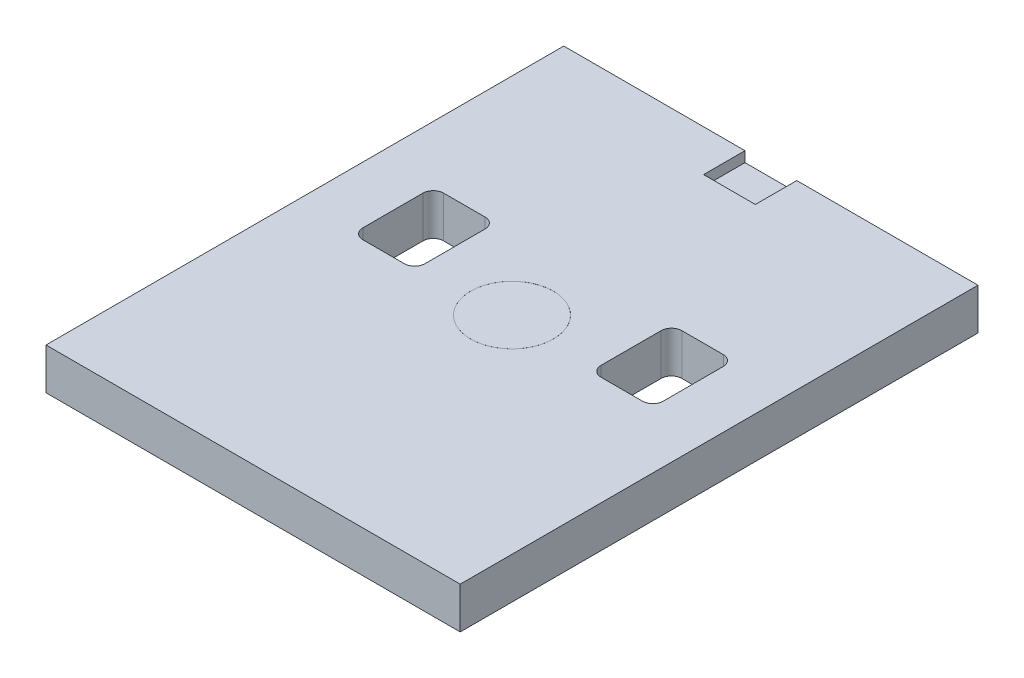
ISO-10303-21;
HEADER;
FILE_DESCRIPTION(('STEP AP214'),'2;1');
FILE_NAME('part.step','',(''),(''),'','','');
FILE_SCHEMA(('AUTOMOTIVE_DESIGN { 1 0 10303 214 1 1 1 1 }'));
ENDSEC;
DATA;
#1=APPLICATION_CONTEXT('core data for automotive mechanical design processes');
#2=APPLICATION_PROTOCOL_DEFINITION('international standard','automotive_design',2000,#1);
#3=PRODUCT_CONTEXT('',#1,'mechanical');
#4=PRODUCT('Part','Part','',(#3));
#5=PRODUCT_RELATED_PRODUCT_CATEGORY('part','',(#4));
#6=PRODUCT_DEFINITION_FORMATION('','',#4);
#7=PRODUCT_DEFINITION_CONTEXT('part definition',#1,'design');
#8=PRODUCT_DEFINITION('design','',#6,#7);
#9=PRODUCT_DEFINITION_SHAPE('','',#8);
#10=(LENGTH_UNIT() NAMED_UNIT(*) SI_UNIT(.MILLI.,.METRE.));
#11=(NAMED_UNIT(*) PLANE_ANGLE_UNIT() SI_UNIT($,.RADIAN.));
#12=(NAMED_UNIT(*) SI_UNIT($,.STERADIAN.) SOLID_ANGLE_UNIT());
#13=UNCERTAINTY_MEASURE_WITH_UNIT(LENGTH_MEASURE(1.E-05),#10,'distance_accuracy_value','');
#14=(GEOMETRIC_REPRESENTATION_CONTEXT(3) GLOBAL_UNCERTAINTY_ASSIGNED_CONTEXT((#13)) GLOBAL_UNIT_ASSIGNED_CONTEXT((#10,
#11,#12)) REPRESENTATION_CONTEXT('',''));
#15=CARTESIAN_POINT('',(0.,0.,0.));
#16=DIRECTION('',(0.,0.,1.));
#17=DIRECTION('',(1.,0.,0.));
#18=AXIS2_PLACEMENT_3D('',#15,#16,#17);
#19=CARTESIAN_POINT('',(-127.,25.4,-158.75));
#20=DIRECTION('',(0.,-1.,0.));
#21=DIRECTION('',(0.,0.,-1.));
#22=AXIS2_PLACEMENT_3D('',#19,#20,#21);
#23=PLANE('',#22);
#24=CARTESIAN_POINT('',(60.3250000000001,25.4,-37.465));
#25=DIRECTION('',(0.,1.,0.));
#26=DIRECTION('',(0.,0.,1.));
#27=AXIS2_PLACEMENT_3D('',#24,#25,#26);
#28=CIRCLE('',#27,6.35);
#29=CARTESIAN_POINT('',(60.3250000000001,25.4,-43.815));
#30=VERTEX_POINT('',#29);
#31=CARTESIAN_POINT('',(53.9750000000001,25.4,-37.465));
#32=VERTEX_POINT('',#31);
#33=EDGE_CURVE('E282',#30,#32,#28,.T.);
#34=ORIENTED_EDGE('',*,*,#33,.F.);
#35=DIRECTION('',(-1.,0.,0.));
#36=VECTOR('',#35,1.);
#37=CARTESIAN_POINT('',(60.3250000000001,25.4,-43.815));
#38=LINE('',#37,#36);
#39=CARTESIAN_POINT('',(85.7250000000001,25.4,-43.815));
#40=VERTEX_POINT('',#39);
#41=EDGE_CURVE('E300',#40,#30,#38,.T.);
#42=ORIENTED_EDGE('',*,*,#41,.F.);
#43=CARTESIAN_POINT('',(85.7250000000001,25.4,-37.465));
#44=DIRECTION('',(0.,1.,0.));
#45=DIRECTION('',(0.,0.,1.));
#46=AXIS2_PLACEMENT_3D('',#43,#44,#45);
#47=CIRCLE('',#46,6.34999999999999);
#48=CARTESIAN_POINT('',(92.0750000000001,25.4,-37.465));
#49=VERTEX_POINT('',#48);
#50=EDGE_CURVE('E297',#49,#40,#47,.T.);
#51=ORIENTED_EDGE('',*,*,#50,.F.);
#52=DIRECTION('',(0.,0.,-1.));
#53=VECTOR('',#52,1.);
#54=CARTESIAN_POINT('',(92.0750000000001,25.4,-37.465));
#55=LINE('',#54,#53);
#56=CARTESIAN_POINT('',(92.0750000000001,25.4,-0.635000000000004));
#57=VERTEX_POINT('',#56);
#58=EDGE_CURVE('E294',#57,#49,#55,.T.);
#59=ORIENTED_EDGE('',*,*,#58,.F.);
#60=CARTESIAN_POINT('',(85.7250000000001,25.4,-0.635000000000004));
#61=DIRECTION('',(0.,1.,0.));
#62=DIRECTION('',(0.,0.,1.));
#63=AXIS2_PLACEMENT_3D('',#60,#61,#62);
#64=CIRCLE('',#63,6.35);
#65=CARTESIAN_POINT('',(85.7250000000001,25.4,5.71499999999999));
#66=VERTEX_POINT('',#65);
#67=EDGE_CURVE('E291',#66,#57,#64,.T.);
#68=ORIENTED_EDGE('',*,*,#67,.F.);
#69=DIRECTION('',(1.,0.,0.));
#70=VECTOR('',#69,1.);
#71=CARTESIAN_POINT('',(60.3250000000001,25.4,5.715));
#72=LINE('',#71,#70);
#73=CARTESIAN_POINT('',(60.3250000000001,25.4,5.715));
#74=VERTEX_POINT('',#73);
#75=EDGE_CURVE('E288',#74,#66,#72,.T.);
#76=ORIENTED_EDGE('',*,*,#75,.F.);
#77=CARTESIAN_POINT('',(60.3250000000001,25.4,-0.635000000000004));
#78=DIRECTION('',(0.,1.,0.));
#79=DIRECTION('',(0.,0.,1.));
#80=AXIS2_PLACEMENT_3D('',#77,#78,#79);
#81=CIRCLE('',#80,6.35);
#82=CARTESIAN_POINT('',(53.9750000000001,25.4,-0.635000000000005));
#83=VERTEX_POINT('',#82);
#84=EDGE_CURVE('E285',#83,#74,#81,.T.);
#85=ORIENTED_EDGE('',*,*,#84,.F.);
#86=DIRECTION('',(0.,0.,1.));
#87=VECTOR('',#86,1.);
#88=CARTESIAN_POINT('',(53.9750000000001,25.4,-37.465));
#89=LINE('',#88,#87);
#90=EDGE_CURVE('E281',#32,#83,#89,.T.);
#91=ORIENTED_EDGE('',*,*,#90,.F.);
#92=EDGE_LOOP('',(#34,#42,#51,#59,#68,#76,#85,#91));
#93=FACE_BOUND('',#92,.T.);
#94=DIRECTION('',(1.,0.,0.));
#95=VECTOR('',#94,1.);
#96=CARTESIAN_POINT('',(-15.875,25.4,-133.35));
#97=LINE('',#96,#95);
#98=CARTESIAN_POINT('',(-15.875,25.4,-133.35));
#99=VERTEX_POINT('',#98);
#100=CARTESIAN_POINT('',(15.875,25.4,-133.35));
#101=VERTEX_POINT('',#100);
#102=EDGE_CURVE('E491',#99,#101,#97,.T.);
#103=ORIENTED_EDGE('',*,*,#102,.F.);
#104=DIRECTION('',(0.,0.,1.));
#105=VECTOR('',#104,1.);
#106=CARTESIAN_POINT('',(-15.875,25.4,-133.35));
#107=LINE('',#106,#105);
#108=CARTESIAN_POINT('',(-15.875,25.4,-158.75));
#109=VERTEX_POINT('',#108);
#110=EDGE_CURVE('E482',#109,#99,#107,.T.);
#111=ORIENTED_EDGE('',*,*,#110,.F.);
#112=DIRECTION('',(-1.,0.,0.));
#113=VECTOR('',#112,1.);
#114=CARTESIAN_POINT('',(-127.,25.4,-158.75));
#115=LINE('',#114,#113);
#116=CARTESIAN_POINT('',(-127.,25.4,-158.75));
#117=VERTEX_POINT('',#116);
#118=EDGE_CURVE('E271',#109,#117,#115,.T.);
#119=ORIENTED_EDGE('',*,*,#118,.T.);
#120=DIRECTION('',(0.,0.,1.));
#121=VECTOR('',#120,1.);
#122=CARTESIAN_POINT('',(-127.,25.4,-158.75));
#123=LINE('',#122,#121);
#124=CARTESIAN_POINT('',(-127.,25.4,158.75));
#125=VERTEX_POINT('',#124);
#126=EDGE_CURVE('E270',#117,#125,#123,.T.);
#127=ORIENTED_EDGE('',*,*,#126,.T.);
#128=DIRECTION('',(1.,0.,0.));
#129=VECTOR('',#128,1.);
#130=CARTESIAN_POINT('',(-127.,25.4,158.75));
#131=LINE('',#130,#129);
#132=CARTESIAN_POINT('',(127.,25.4,158.75));
#133=VERTEX_POINT('',#132);
#134=EDGE_CURVE('E273',#125,#133,#131,.T.);
#135=ORIENTED_EDGE('',*,*,#134,.T.);
#136=DIRECTION('',(0.,0.,-1.));
#137=VECTOR('',#136,1.);
#138=CARTESIAN_POINT('',(127.,25.4,-158.75));
#139=LINE('',#138,#137);
#140=CARTESIAN_POINT('',(127.,25.4,-158.75));
#141=VERTEX_POINT('',#140);
#142=EDGE_CURVE('E268',#133,#141,#139,.T.);
#143=ORIENTED_EDGE('',*,*,#142,.T.);
#144=CARTESIAN_POINT('',(15.875,25.4,-158.75));
#145=VERTEX_POINT('',#144);
#146=EDGE_CURVE('E256',#141,#145,#115,.T.);
#147=ORIENTED_EDGE('',*,*,#146,.T.);
#148=DIRECTION('',(0.,0.,-1.));
#149=VECTOR('',#148,1.);
#150=CARTESIAN_POINT('',(15.875,25.4,-133.35));
#151=LINE('',#150,#149);
#152=EDGE_CURVE('E266',#101,#145,#151,.T.);
#153=ORIENTED_EDGE('',*,*,#152,.F.);
#154=EDGE_LOOP('',(#103,#111,#119,#127,#135,#143,#147,#153));
#155=FACE_BOUND('',#154,.T.);
#156=CARTESIAN_POINT('',(-60.3250000000001,25.4,-0.635000000000004));
#157=DIRECTION('',(0.,1.,0.));
#158=DIRECTION('',(0.,0.,-1.));
#159=AXIS2_PLACEMENT_3D('',#156,#157,#158);
#160=CIRCLE('',#159,6.35);
#161=CARTESIAN_POINT('',(-60.3250000000001,25.4,5.715));
#162=VERTEX_POINT('',#161);
#163=CARTESIAN_POINT('',(-53.9750000000001,25.4,-0.635000000000004));
#164=VERTEX_POINT('',#163);
#165=EDGE_CURVE('E95',#162,#164,#160,.T.);
#166=ORIENTED_EDGE('',*,*,#165,.F.);
#167=DIRECTION('',(1.,0.,0.));
#168=VECTOR('',#167,1.);
#169=CARTESIAN_POINT('',(-60.3250000000001,25.4,5.715));
#170=LINE('',#169,#168);
#171=CARTESIAN_POINT('',(-85.7250000000001,25.4,5.715));
#172=VERTEX_POINT('',#171);
#173=EDGE_CURVE('E62',#172,#162,#170,.T.);
#174=ORIENTED_EDGE('',*,*,#173,.F.);
#175=CARTESIAN_POINT('',(-85.7250000000001,25.4,-0.635000000000004));
#176=DIRECTION('',(0.,1.,0.));
#177=DIRECTION('',(0.,0.,-1.));
#178=AXIS2_PLACEMENT_3D('',#175,#176,#177);
#179=CIRCLE('',#178,6.35);
#180=CARTESIAN_POINT('',(-92.0750000000001,25.4,-0.635000000000004));
#181=VERTEX_POINT('',#180);
#182=EDGE_CURVE('E221',#181,#172,#179,.T.);
#183=ORIENTED_EDGE('',*,*,#182,.F.);
#184=DIRECTION('',(0.,0.,1.));
#185=VECTOR('',#184,1.);
#186=CARTESIAN_POINT('',(-92.0750000000001,25.4,-37.465));
#187=LINE('',#186,#185);
#188=CARTESIAN_POINT('',(-92.0750000000001,25.4,-37.465));
#189=VERTEX_POINT('',#188);
#190=EDGE_CURVE('E225',#189,#181,#187,.T.);
#191=ORIENTED_EDGE('',*,*,#190,.F.);
#192=CARTESIAN_POINT('',(-85.7250000000001,25.4,-37.465));
#193=DIRECTION('',(0.,1.,0.));
#194=DIRECTION('',(0.,0.,-1.));
#195=AXIS2_PLACEMENT_3D('',#192,#193,#194);
#196=CIRCLE('',#195,6.34999999999999);
#197=CARTESIAN_POINT('',(-85.7250000000001,25.4,-43.815));
#198=VERTEX_POINT('',#197);
#199=EDGE_CURVE('E228',#198,#189,#196,.T.);
#200=ORIENTED_EDGE('',*,*,#199,.F.);
#201=DIRECTION('',(-1.,0.,0.));
#202=VECTOR('',#201,1.);
#203=CARTESIAN_POINT('',(-60.3250000000001,25.4,-43.815));
#204=LINE('',#203,#202);
#205=CARTESIAN_POINT('',(-60.3250000000001,25.4,-43.815));
#206=VERTEX_POINT('',#205);
#207=EDGE_CURVE('E231',#206,#198,#204,.T.);
#208=ORIENTED_EDGE('',*,*,#207,.F.);
#209=CARTESIAN_POINT('',(-60.3250000000001,25.4,-37.465));
#210=DIRECTION('',(0.,1.,0.));
#211=DIRECTION('',(0.,0.,-1.));
#212=AXIS2_PLACEMENT_3D('',#209,#210,#211);
#213=CIRCLE('',#212,6.35);
#214=CARTESIAN_POINT('',(-53.9750000000001,25.4,-37.465));
#215=VERTEX_POINT('',#214);
#216=EDGE_CURVE('E198',#215,#206,#213,.T.);
#217=ORIENTED_EDGE('',*,*,#216,.F.);
#218=DIRECTION('',(0.,0.,-1.));
#219=VECTOR('',#218,1.);
#220=CARTESIAN_POINT('',(-53.9750000000001,25.4,-37.465));
#221=LINE('',#220,#219);
#222=EDGE_CURVE('E195',#164,#215,#221,.T.);
#223=ORIENTED_EDGE('',*,*,#222,.F.);
#224=EDGE_LOOP('',(#166,#174,#183,#191,#200,#208,#217,#223));
#225=FACE_BOUND('',#224,.T.);
#226=CARTESIAN_POINT('',(0.,25.4,0.));
#227=DIRECTION('',(0.,1.,0.));
#228=DIRECTION('',(0.,0.,1.));
#229=AXIS2_PLACEMENT_3D('',#226,#227,#228);
#230=CIRCLE('',#229,25.4);
#231=CARTESIAN_POINT('',(0.,25.4,25.4));
#232=VERTEX_POINT('',#231);
#233=EDGE_CURVE('E243',#232,#232,#230,.T.);
#234=ORIENTED_EDGE('',*,*,#233,.F.);
#235=EDGE_LOOP('',(#234));
#236=FACE_BOUND('',#235,.T.);
#237=ADVANCED_FACE('F39',(#93,#155,#225,#236),#23,.F.);
#238=CARTESIAN_POINT('',(-127.,0.,-158.75));
#239=DIRECTION('',(0.,-1.,0.));
#240=DIRECTION('',(0.,0.,-1.));
#241=AXIS2_PLACEMENT_3D('',#238,#239,#240);
#242=PLANE('',#241);
#243=DIRECTION('',(-1.,0.,0.));
#244=VECTOR('',#243,1.);
#245=CARTESIAN_POINT('',(60.3250000000001,0.,-43.815));
#246=LINE('',#245,#244);
#247=CARTESIAN_POINT('',(85.7250000000001,0.,-43.815));
#248=VERTEX_POINT('',#247);
#249=CARTESIAN_POINT('',(60.3250000000001,0.,-43.815));
#250=VERTEX_POINT('',#249);
#251=EDGE_CURVE('E303',#248,#250,#246,.T.);
#252=ORIENTED_EDGE('',*,*,#251,.T.);
#253=CARTESIAN_POINT('',(60.3250000000001,0.,-37.465));
#254=DIRECTION('',(0.,1.,0.));
#255=DIRECTION('',(0.,0.,1.));
#256=AXIS2_PLACEMENT_3D('',#253,#254,#255);
#257=CIRCLE('',#256,6.35);
#258=CARTESIAN_POINT('',(53.9750000000001,0.,-37.465));
#259=VERTEX_POINT('',#258);
#260=EDGE_CURVE('E306',#250,#259,#257,.T.);
#261=ORIENTED_EDGE('',*,*,#260,.T.);
#262=DIRECTION('',(0.,0.,1.));
#263=VECTOR('',#262,1.);
#264=CARTESIAN_POINT('',(53.9750000000001,0.,-37.465));
#265=LINE('',#264,#263);
#266=CARTESIAN_POINT('',(53.9750000000001,0.,-0.635000000000005));
#267=VERTEX_POINT('',#266);
#268=EDGE_CURVE('E322',#259,#267,#265,.T.);
#269=ORIENTED_EDGE('',*,*,#268,.T.);
#270=CARTESIAN_POINT('',(60.3250000000001,0.,-0.635000000000004));
#271=DIRECTION('',(0.,1.,0.));
#272=DIRECTION('',(0.,0.,1.));
#273=AXIS2_PLACEMENT_3D('',#270,#271,#272);
#274=CIRCLE('',#273,6.35);
#275=CARTESIAN_POINT('',(60.3250000000001,0.,5.715));
#276=VERTEX_POINT('',#275);
#277=EDGE_CURVE('E319',#267,#276,#274,.T.);
#278=ORIENTED_EDGE('',*,*,#277,.T.);
#279=DIRECTION('',(1.,0.,0.));
#280=VECTOR('',#279,1.);
#281=CARTESIAN_POINT('',(60.3250000000001,0.,5.715));
#282=LINE('',#281,#280);
#283=CARTESIAN_POINT('',(85.7250000000001,0.,5.71499999999999));
#284=VERTEX_POINT('',#283);
#285=EDGE_CURVE('E316',#276,#284,#282,.T.);
#286=ORIENTED_EDGE('',*,*,#285,.T.);
#287=CARTESIAN_POINT('',(85.7250000000001,0.,-0.635000000000004));
#288=DIRECTION('',(0.,1.,0.));
#289=DIRECTION('',(0.,0.,1.));
#290=AXIS2_PLACEMENT_3D('',#287,#288,#289);
#291=CIRCLE('',#290,6.35);
#292=CARTESIAN_POINT('',(92.0750000000001,0.,-0.635000000000004));
#293=VERTEX_POINT('',#292);
#294=EDGE_CURVE('E313',#284,#293,#291,.T.);
#295=ORIENTED_EDGE('',*,*,#294,.T.);
#296=DIRECTION('',(0.,0.,-1.));
#297=VECTOR('',#296,1.);
#298=CARTESIAN_POINT('',(92.0750000000001,0.,-37.465));
#299=LINE('',#298,#297);
#300=CARTESIAN_POINT('',(92.0750000000001,0.,-37.465));
#301=VERTEX_POINT('',#300);
#302=EDGE_CURVE('E310',#293,#301,#299,.T.);
#303=ORIENTED_EDGE('',*,*,#302,.T.);
#304=CARTESIAN_POINT('',(85.7250000000001,0.,-37.465));
#305=DIRECTION('',(0.,1.,0.));
#306=DIRECTION('',(0.,0.,1.));
#307=AXIS2_PLACEMENT_3D('',#304,#305,#306);
#308=CIRCLE('',#307,6.34999999999999);
#309=EDGE_CURVE('E307',#301,#248,#308,.T.);
#310=ORIENTED_EDGE('',*,*,#309,.T.);
#311=EDGE_LOOP('',(#252,#261,#269,#278,#286,#295,#303,#310));
#312=FACE_BOUND('',#311,.T.);
#313=DIRECTION('',(-1.,0.,0.));
#314=VECTOR('',#313,1.);
#315=CARTESIAN_POINT('',(-127.,0.,-158.75));
#316=LINE('',#315,#314);
#317=CARTESIAN_POINT('',(127.,0.,-158.75));
#318=VERTEX_POINT('',#317);
#319=CARTESIAN_POINT('',(-127.,0.,-158.75));
#320=VERTEX_POINT('',#319);
#321=EDGE_CURVE('E241',#318,#320,#316,.T.);
#322=ORIENTED_EDGE('',*,*,#321,.F.);
#323=DIRECTION('',(0.,0.,-1.));
#324=VECTOR('',#323,1.);
#325=CARTESIAN_POINT('',(127.,0.,-158.75));
#326=LINE('',#325,#324);
#327=CARTESIAN_POINT('',(127.,0.,158.75));
#328=VERTEX_POINT('',#327);
#329=EDGE_CURVE('E503',#328,#318,#326,.T.);
#330=ORIENTED_EDGE('',*,*,#329,.F.);
#331=DIRECTION('',(1.,0.,0.));
#332=VECTOR('',#331,1.);
#333=CARTESIAN_POINT('',(-127.,0.,158.75));
#334=LINE('',#333,#332);
#335=CARTESIAN_POINT('',(-127.,0.,158.75));
#336=VERTEX_POINT('',#335);
#337=EDGE_CURVE('E498',#336,#328,#334,.T.);
#338=ORIENTED_EDGE('',*,*,#337,.F.);
#339=DIRECTION('',(0.,0.,1.));
#340=VECTOR('',#339,1.);
#341=CARTESIAN_POINT('',(-127.,0.,-158.75));
#342=LINE('',#341,#340);
#343=EDGE_CURVE('E499',#320,#336,#342,.T.);
#344=ORIENTED_EDGE('',*,*,#343,.F.);
#345=EDGE_LOOP('',(#322,#330,#338,#344));
#346=FACE_BOUND('',#345,.T.);
#347=DIRECTION('',(1.,0.,0.));
#348=VECTOR('',#347,1.);
#349=CARTESIAN_POINT('',(-60.3250000000001,0.,5.715));
#350=LINE('',#349,#348);
#351=CARTESIAN_POINT('',(-85.7250000000001,0.,5.71499999999999));
#352=VERTEX_POINT('',#351);
#353=CARTESIAN_POINT('',(-60.3250000000001,0.,5.71500000000001));
#354=VERTEX_POINT('',#353);
#355=EDGE_CURVE('E214',#352,#354,#350,.T.);
#356=ORIENTED_EDGE('',*,*,#355,.T.);
#357=CARTESIAN_POINT('',(-60.3250000000001,0.,-0.635000000000004));
#358=DIRECTION('',(0.,1.,0.));
#359=DIRECTION('',(0.,0.,-1.));
#360=AXIS2_PLACEMENT_3D('',#357,#358,#359);
#361=CIRCLE('',#360,6.35);
#362=CARTESIAN_POINT('',(-53.9750000000001,0.,-0.635000000000004));
#363=VERTEX_POINT('',#362);
#364=EDGE_CURVE('E102',#354,#363,#361,.T.);
#365=ORIENTED_EDGE('',*,*,#364,.T.);
#366=DIRECTION('',(0.,0.,-1.));
#367=VECTOR('',#366,1.);
#368=CARTESIAN_POINT('',(-53.9750000000001,0.,-37.465));
#369=LINE('',#368,#367);
#370=CARTESIAN_POINT('',(-53.9750000000001,0.,-37.465));
#371=VERTEX_POINT('',#370);
#372=EDGE_CURVE('E193',#363,#371,#369,.T.);
#373=ORIENTED_EDGE('',*,*,#372,.T.);
#374=CARTESIAN_POINT('',(-60.3250000000001,0.,-37.465));
#375=DIRECTION('',(0.,1.,0.));
#376=DIRECTION('',(0.,0.,-1.));
#377=AXIS2_PLACEMENT_3D('',#374,#375,#376);
#378=CIRCLE('',#377,6.35);
#379=CARTESIAN_POINT('',(-60.3250000000001,0.,-43.815));
#380=VERTEX_POINT('',#379);
#381=EDGE_CURVE('E201',#371,#380,#378,.T.);
#382=ORIENTED_EDGE('',*,*,#381,.T.);
#383=DIRECTION('',(-1.,0.,0.));
#384=VECTOR('',#383,1.);
#385=CARTESIAN_POINT('',(-60.3250000000001,0.,-43.815));
#386=LINE('',#385,#384);
#387=CARTESIAN_POINT('',(-85.7250000000001,0.,-43.815));
#388=VERTEX_POINT('',#387);
#389=EDGE_CURVE('E208',#380,#388,#386,.T.);
#390=ORIENTED_EDGE('',*,*,#389,.T.);
#391=CARTESIAN_POINT('',(-85.7250000000001,0.,-37.465));
#392=DIRECTION('',(0.,1.,0.));
#393=DIRECTION('',(0.,0.,-1.));
#394=AXIS2_PLACEMENT_3D('',#391,#392,#393);
#395=CIRCLE('',#394,6.34999999999999);
#396=CARTESIAN_POINT('',(-92.0750000000001,0.,-37.465));
#397=VERTEX_POINT('',#396);
#398=EDGE_CURVE('E350',#388,#397,#395,.T.);
#399=ORIENTED_EDGE('',*,*,#398,.T.);
#400=DIRECTION('',(0.,0.,1.));
#401=VECTOR('',#400,1.);
#402=CARTESIAN_POINT('',(-92.0750000000001,0.,-37.465));
#403=LINE('',#402,#401);
#404=CARTESIAN_POINT('',(-92.0750000000001,0.,-0.635000000000004));
#405=VERTEX_POINT('',#404);
#406=EDGE_CURVE('E347',#397,#405,#403,.T.);
#407=ORIENTED_EDGE('',*,*,#406,.T.);
#408=CARTESIAN_POINT('',(-85.7250000000001,0.,-0.635000000000004));
#409=DIRECTION('',(0.,1.,0.));
#410=DIRECTION('',(0.,0.,-1.));
#411=AXIS2_PLACEMENT_3D('',#408,#409,#410);
#412=CIRCLE('',#411,6.35);
#413=EDGE_CURVE('E242',#405,#352,#412,.T.);
#414=ORIENTED_EDGE('',*,*,#413,.T.);
#415=EDGE_LOOP('',(#356,#365,#373,#382,#390,#399,#407,#414));
#416=FACE_BOUND('',#415,.T.);
#417=CARTESIAN_POINT('',(0.,0.,0.));
#418=DIRECTION('',(0.,1.,0.));
#419=DIRECTION('',(0.,0.,1.));
#420=AXIS2_PLACEMENT_3D('',#417,#418,#419);
#421=CIRCLE('',#420,25.4);
#422=CARTESIAN_POINT('',(0.,0.,25.4));
#423=VERTEX_POINT('',#422);
#424=EDGE_CURVE('E238',#423,#423,#421,.T.);
#425=ORIENTED_EDGE('',*,*,#424,.T.);
#426=EDGE_LOOP('',(#425));
#427=FACE_BOUND('',#426,.T.);
#428=ADVANCED_FACE('F211',(#312,#346,#416,#427),#242,.T.);
#429=CARTESIAN_POINT('',(-127.,25.4,-158.75));
#430=DIRECTION('',(0.,0.,1.));
#431=DIRECTION('',(1.,0.,0.));
#432=AXIS2_PLACEMENT_3D('',#429,#430,#431);
#433=PLANE('',#432);
#434=ORIENTED_EDGE('',*,*,#118,.F.);
#435=DIRECTION('',(0.,-1.,0.));
#436=VECTOR('',#435,1.);
#437=CARTESIAN_POINT('',(-15.875,25.4,-158.75));
#438=LINE('',#437,#436);
#439=CARTESIAN_POINT('',(-15.875,19.05,-158.75));
#440=VERTEX_POINT('',#439);
#441=EDGE_CURVE('E12',#109,#440,#438,.T.);
#442=ORIENTED_EDGE('',*,*,#441,.T.);
#443=DIRECTION('',(1.,0.,0.));
#444=VECTOR('',#443,1.);
#445=CARTESIAN_POINT('',(-127.,19.05,-158.75));
#446=LINE('',#445,#444);
#447=CARTESIAN_POINT('',(15.875,19.05,-158.75));
#448=VERTEX_POINT('',#447);
#449=EDGE_CURVE('E246',#440,#448,#446,.T.);
#450=ORIENTED_EDGE('',*,*,#449,.T.);
#451=DIRECTION('',(0.,1.,0.));
#452=VECTOR('',#451,1.);
#453=CARTESIAN_POINT('',(15.875,25.4,-158.75));
#454=LINE('',#453,#452);
#455=EDGE_CURVE('E46',#448,#145,#454,.T.);
#456=ORIENTED_EDGE('',*,*,#455,.T.);
#457=ORIENTED_EDGE('',*,*,#146,.F.);
#458=DIRECTION('',(0.,-1.,0.));
#459=VECTOR('',#458,1.);
#460=CARTESIAN_POINT('',(127.,25.4,-158.75));
#461=LINE('',#460,#459);
#462=EDGE_CURVE('E506',#141,#318,#461,.T.);
#463=ORIENTED_EDGE('',*,*,#462,.T.);
#464=ORIENTED_EDGE('',*,*,#321,.T.);
#465=DIRECTION('',(0.,-1.,0.));
#466=VECTOR('',#465,1.);
#467=CARTESIAN_POINT('',(-127.,25.4,-158.75));
#468=LINE('',#467,#466);
#469=EDGE_CURVE('E495',#117,#320,#468,.T.);
#470=ORIENTED_EDGE('',*,*,#469,.F.);
#471=EDGE_LOOP('',(#434,#442,#450,#456,#457,#463,#464,#470));
#472=FACE_BOUND('',#471,.T.);
#473=ADVANCED_FACE('F254',(#472),#433,.F.);
#474=CARTESIAN_POINT('',(-127.,25.4,-158.75));
#475=DIRECTION('',(1.,0.,0.));
#476=DIRECTION('',(0.,0.,-1.));
#477=AXIS2_PLACEMENT_3D('',#474,#475,#476);
#478=PLANE('',#477);
#479=ORIENTED_EDGE('',*,*,#343,.T.);
#480=DIRECTION('',(0.,-1.,0.));
#481=VECTOR('',#480,1.);
#482=CARTESIAN_POINT('',(-127.,25.4,158.75));
#483=LINE('',#482,#481);
#484=EDGE_CURVE('E500',#125,#336,#483,.T.);
#485=ORIENTED_EDGE('',*,*,#484,.F.);
#486=ORIENTED_EDGE('',*,*,#126,.F.);
#487=ORIENTED_EDGE('',*,*,#469,.T.);
#488=EDGE_LOOP('',(#479,#485,#486,#487));
#489=FACE_BOUND('',#488,.T.);
#490=ADVANCED_FACE('F389',(#489),#478,.F.);
#491=CARTESIAN_POINT('',(-127.,25.4,158.75));
#492=DIRECTION('',(0.,0.,-1.));
#493=DIRECTION('',(-1.,0.,0.));
#494=AXIS2_PLACEMENT_3D('',#491,#492,#493);
#495=PLANE('',#494);
#496=ORIENTED_EDGE('',*,*,#337,.T.);
#497=DIRECTION('',(0.,-1.,0.));
#498=VECTOR('',#497,1.);
#499=CARTESIAN_POINT('',(127.,25.4,158.75));
#500=LINE('',#499,#498);
#501=EDGE_CURVE('E336',#133,#328,#500,.T.);
#502=ORIENTED_EDGE('',*,*,#501,.F.);
#503=ORIENTED_EDGE('',*,*,#134,.F.);
#504=ORIENTED_EDGE('',*,*,#484,.T.);
#505=EDGE_LOOP('',(#496,#502,#503,#504));
#506=FACE_BOUND('',#505,.T.);
#507=ADVANCED_FACE('F444',(#506),#495,.F.);
#508=CARTESIAN_POINT('',(127.,25.4,-158.75));
#509=DIRECTION('',(-1.,0.,0.));
#510=DIRECTION('',(0.,0.,1.));
#511=AXIS2_PLACEMENT_3D('',#508,#509,#510);
#512=PLANE('',#511);
#513=ORIENTED_EDGE('',*,*,#329,.T.);
#514=ORIENTED_EDGE('',*,*,#462,.F.);
#515=ORIENTED_EDGE('',*,*,#142,.F.);
#516=ORIENTED_EDGE('',*,*,#501,.T.);
#517=EDGE_LOOP('',(#513,#514,#515,#516));
#518=FACE_BOUND('',#517,.T.);
#519=ADVANCED_FACE('F440',(#518),#512,.F.);
#520=CARTESIAN_POINT('',(60.3250000000001,25.4,-37.465));
#521=DIRECTION('',(0.,-1.,0.));
#522=DIRECTION('',(0.,0.,-1.));
#523=AXIS2_PLACEMENT_3D('',#520,#521,#522);
#524=CYLINDRICAL_SURFACE('',#523,6.35);
#525=ORIENTED_EDGE('',*,*,#260,.F.);
#526=DIRECTION('',(0.,-1.,0.));
#527=VECTOR('',#526,1.);
#528=CARTESIAN_POINT('',(60.3250000000001,25.4,-43.815));
#529=LINE('',#528,#527);
#530=EDGE_CURVE('E237',#30,#250,#529,.T.);
#531=ORIENTED_EDGE('',*,*,#530,.F.);
#532=ORIENTED_EDGE('',*,*,#33,.T.);
#533=DIRECTION('',(0.,-1.,0.));
#534=VECTOR('',#533,1.);
#535=CARTESIAN_POINT('',(53.9750000000001,25.4,-37.465));
#536=LINE('',#535,#534);
#537=EDGE_CURVE('E278',#32,#259,#536,.T.);
#538=ORIENTED_EDGE('',*,*,#537,.T.);
#539=EDGE_LOOP('',(#525,#531,#532,#538));
#540=FACE_BOUND('',#539,.T.);
#541=ADVANCED_FACE('F436',(#540),#524,.F.);
#542=CARTESIAN_POINT('',(53.9750000000001,25.4,-37.465));
#543=DIRECTION('',(1.,0.,0.));
#544=DIRECTION('',(0.,0.,-1.));
#545=AXIS2_PLACEMENT_3D('',#542,#543,#544);
#546=PLANE('',#545);
#547=ORIENTED_EDGE('',*,*,#268,.F.);
#548=ORIENTED_EDGE('',*,*,#537,.F.);
#549=ORIENTED_EDGE('',*,*,#90,.T.);
#550=DIRECTION('',(0.,-1.,0.));
#551=VECTOR('',#550,1.);
#552=CARTESIAN_POINT('',(53.9750000000001,25.4,-0.635000000000005));
#553=LINE('',#552,#551);
#554=EDGE_CURVE('E283',#83,#267,#553,.T.);
#555=ORIENTED_EDGE('',*,*,#554,.T.);
#556=EDGE_LOOP('',(#547,#548,#549,#555));
#557=FACE_BOUND('',#556,.T.);
#558=ADVANCED_FACE('F432',(#557),#546,.T.);
#559=CARTESIAN_POINT('',(60.3250000000001,25.4,-0.635000000000004));
#560=DIRECTION('',(0.,-1.,0.));
#561=DIRECTION('',(0.,0.,-1.));
#562=AXIS2_PLACEMENT_3D('',#559,#560,#561);
#563=CYLINDRICAL_SURFACE('',#562,6.35);
#564=ORIENTED_EDGE('',*,*,#277,.F.);
#565=ORIENTED_EDGE('',*,*,#554,.F.);
#566=ORIENTED_EDGE('',*,*,#84,.T.);
#567=DIRECTION('',(0.,-1.,0.));
#568=VECTOR('',#567,1.);
#569=CARTESIAN_POINT('',(60.3250000000001,25.4,5.715));
#570=LINE('',#569,#568);
#571=EDGE_CURVE('E286',#74,#276,#570,.T.);
#572=ORIENTED_EDGE('',*,*,#571,.T.);
#573=EDGE_LOOP('',(#564,#565,#566,#572));
#574=FACE_BOUND('',#573,.T.);
#575=ADVANCED_FACE('F428',(#574),#563,.F.);
#576=CARTESIAN_POINT('',(60.3250000000001,25.4,5.715));
#577=DIRECTION('',(0.,0.,-1.));
#578=DIRECTION('',(-1.,0.,0.));
#579=AXIS2_PLACEMENT_3D('',#576,#577,#578);
#580=PLANE('',#579);
#581=ORIENTED_EDGE('',*,*,#285,.F.);
#582=ORIENTED_EDGE('',*,*,#571,.F.);
#583=ORIENTED_EDGE('',*,*,#75,.T.);
#584=DIRECTION('',(0.,-1.,0.));
#585=VECTOR('',#584,1.);
#586=CARTESIAN_POINT('',(85.7250000000001,25.4,5.71499999999999));
#587=LINE('',#586,#585);
#588=EDGE_CURVE('E289',#66,#284,#587,.T.);
#589=ORIENTED_EDGE('',*,*,#588,.T.);
#590=EDGE_LOOP('',(#581,#582,#583,#589));
#591=FACE_BOUND('',#590,.T.);
#592=ADVANCED_FACE('F424',(#591),#580,.T.);
#593=CARTESIAN_POINT('',(85.7250000000001,25.4,-0.635000000000004));
#594=DIRECTION('',(0.,-1.,0.));
#595=DIRECTION('',(0.,0.,-1.));
#596=AXIS2_PLACEMENT_3D('',#593,#594,#595);
#597=CYLINDRICAL_SURFACE('',#596,6.35);
#598=ORIENTED_EDGE('',*,*,#294,.F.);
#599=ORIENTED_EDGE('',*,*,#588,.F.);
#600=ORIENTED_EDGE('',*,*,#67,.T.);
#601=DIRECTION('',(0.,-1.,0.));
#602=VECTOR('',#601,1.);
#603=CARTESIAN_POINT('',(92.0750000000001,25.4,-0.635000000000004));
#604=LINE('',#603,#602);
#605=EDGE_CURVE('E292',#57,#293,#604,.T.);
#606=ORIENTED_EDGE('',*,*,#605,.T.);
#607=EDGE_LOOP('',(#598,#599,#600,#606));
#608=FACE_BOUND('',#607,.T.);
#609=ADVANCED_FACE('F420',(#608),#597,.F.);
#610=CARTESIAN_POINT('',(92.0750000000001,25.4,-37.465));
#611=DIRECTION('',(-1.,0.,0.));
#612=DIRECTION('',(0.,0.,1.));
#613=AXIS2_PLACEMENT_3D('',#610,#611,#612);
#614=PLANE('',#613);
#615=ORIENTED_EDGE('',*,*,#302,.F.);
#616=ORIENTED_EDGE('',*,*,#605,.F.);
#617=ORIENTED_EDGE('',*,*,#58,.T.);
#618=DIRECTION('',(0.,-1.,0.));
#619=VECTOR('',#618,1.);
#620=CARTESIAN_POINT('',(92.0750000000001,25.4,-37.465));
#621=LINE('',#620,#619);
#622=EDGE_CURVE('E295',#49,#301,#621,.T.);
#623=ORIENTED_EDGE('',*,*,#622,.T.);
#624=EDGE_LOOP('',(#615,#616,#617,#623));
#625=FACE_BOUND('',#624,.T.);
#626=ADVANCED_FACE('F416',(#625),#614,.T.);
#627=CARTESIAN_POINT('',(85.7250000000001,25.4,-37.465));
#628=DIRECTION('',(0.,-1.,0.));
#629=DIRECTION('',(0.,0.,-1.));
#630=AXIS2_PLACEMENT_3D('',#627,#628,#629);
#631=CYLINDRICAL_SURFACE('',#630,6.34999999999999);
#632=ORIENTED_EDGE('',*,*,#309,.F.);
#633=ORIENTED_EDGE('',*,*,#622,.F.);
#634=ORIENTED_EDGE('',*,*,#50,.T.);
#635=DIRECTION('',(0.,-1.,0.));
#636=VECTOR('',#635,1.);
#637=CARTESIAN_POINT('',(85.7250000000001,25.4,-43.815));
#638=LINE('',#637,#636);
#639=EDGE_CURVE('E298',#40,#248,#638,.T.);
#640=ORIENTED_EDGE('',*,*,#639,.T.);
#641=EDGE_LOOP('',(#632,#633,#634,#640));
#642=FACE_BOUND('',#641,.T.);
#643=ADVANCED_FACE('F412',(#642),#631,.F.);
#644=CARTESIAN_POINT('',(60.3250000000001,25.4,-43.815));
#645=DIRECTION('',(0.,0.,1.));
#646=DIRECTION('',(1.,0.,0.));
#647=AXIS2_PLACEMENT_3D('',#644,#645,#646);
#648=PLANE('',#647);
#649=ORIENTED_EDGE('',*,*,#251,.F.);
#650=ORIENTED_EDGE('',*,*,#639,.F.);
#651=ORIENTED_EDGE('',*,*,#41,.T.);
#652=ORIENTED_EDGE('',*,*,#530,.T.);
#653=EDGE_LOOP('',(#649,#650,#651,#652));
#654=FACE_BOUND('',#653,.T.);
#655=ADVANCED_FACE('F409',(#654),#648,.T.);
#656=CARTESIAN_POINT('',(-60.3250000000001,25.4,-0.635000000000004));
#657=DIRECTION('',(0.,-1.,0.));
#658=DIRECTION('',(0.,0.,-1.));
#659=AXIS2_PLACEMENT_3D('',#656,#657,#658);
#660=CYLINDRICAL_SURFACE('',#659,6.35);
#661=ORIENTED_EDGE('',*,*,#364,.F.);
#662=DIRECTION('',(0.,-1.,0.));
#663=VECTOR('',#662,1.);
#664=CARTESIAN_POINT('',(-60.3250000000001,25.4,5.715));
#665=LINE('',#664,#663);
#666=EDGE_CURVE('E219',#162,#354,#665,.T.);
#667=ORIENTED_EDGE('',*,*,#666,.F.);
#668=ORIENTED_EDGE('',*,*,#165,.T.);
#669=DIRECTION('',(0.,-1.,0.));
#670=VECTOR('',#669,1.);
#671=CARTESIAN_POINT('',(-53.9750000000001,25.4,-0.635000000000004));
#672=LINE('',#671,#670);
#673=EDGE_CURVE('E235',#164,#363,#672,.T.);
#674=ORIENTED_EDGE('',*,*,#673,.T.);
#675=EDGE_LOOP('',(#661,#667,#668,#674));
#676=FACE_BOUND('',#675,.T.);
#677=ADVANCED_FACE('F372',(#676),#660,.F.);
#678=CARTESIAN_POINT('',(-53.9750000000001,25.4,-37.465));
#679=DIRECTION('',(-1.,0.,0.));
#680=DIRECTION('',(0.,0.,1.));
#681=AXIS2_PLACEMENT_3D('',#678,#679,#680);
#682=PLANE('',#681);
#683=ORIENTED_EDGE('',*,*,#372,.F.);
#684=ORIENTED_EDGE('',*,*,#673,.F.);
#685=ORIENTED_EDGE('',*,*,#222,.T.);
#686=DIRECTION('',(0.,-1.,0.));
#687=VECTOR('',#686,1.);
#688=CARTESIAN_POINT('',(-53.9750000000001,25.4,-37.465));
#689=LINE('',#688,#687);
#690=EDGE_CURVE('E189',#215,#371,#689,.T.);
#691=ORIENTED_EDGE('',*,*,#690,.T.);
#692=EDGE_LOOP('',(#683,#684,#685,#691));
#693=FACE_BOUND('',#692,.T.);
#694=ADVANCED_FACE('F191',(#693),#682,.T.);
#695=CARTESIAN_POINT('',(-60.3250000000001,25.4,-37.465));
#696=DIRECTION('',(0.,-1.,0.));
#697=DIRECTION('',(0.,0.,-1.));
#698=AXIS2_PLACEMENT_3D('',#695,#696,#697);
#699=CYLINDRICAL_SURFACE('',#698,6.35);
#700=ORIENTED_EDGE('',*,*,#381,.F.);
#701=ORIENTED_EDGE('',*,*,#690,.F.);
#702=ORIENTED_EDGE('',*,*,#216,.T.);
#703=DIRECTION('',(0.,-1.,0.));
#704=VECTOR('',#703,1.);
#705=CARTESIAN_POINT('',(-60.3250000000001,25.4,-43.815));
#706=LINE('',#705,#704);
#707=EDGE_CURVE('E204',#206,#380,#706,.T.);
#708=ORIENTED_EDGE('',*,*,#707,.T.);
#709=EDGE_LOOP('',(#700,#701,#702,#708));
#710=FACE_BOUND('',#709,.T.);
#711=ADVANCED_FACE('F202',(#710),#699,.F.);
#712=CARTESIAN_POINT('',(-60.3250000000001,25.4,-43.815));
#713=DIRECTION('',(0.,0.,1.));
#714=DIRECTION('',(1.,0.,0.));
#715=AXIS2_PLACEMENT_3D('',#712,#713,#714);
#716=PLANE('',#715);
#717=ORIENTED_EDGE('',*,*,#389,.F.);
#718=ORIENTED_EDGE('',*,*,#707,.F.);
#719=ORIENTED_EDGE('',*,*,#207,.T.);
#720=DIRECTION('',(0.,-1.,0.));
#721=VECTOR('',#720,1.);
#722=CARTESIAN_POINT('',(-85.7250000000001,25.4,-43.815));
#723=LINE('',#722,#721);
#724=EDGE_CURVE('E230',#198,#388,#723,.T.);
#725=ORIENTED_EDGE('',*,*,#724,.T.);
#726=EDGE_LOOP('',(#717,#718,#719,#725));
#727=FACE_BOUND('',#726,.T.);
#728=ADVANCED_FACE('F354',(#727),#716,.T.);
#729=CARTESIAN_POINT('',(-85.7250000000001,25.4,-37.465));
#730=DIRECTION('',(0.,-1.,0.));
#731=DIRECTION('',(0.,0.,-1.));
#732=AXIS2_PLACEMENT_3D('',#729,#730,#731);
#733=CYLINDRICAL_SURFACE('',#732,6.34999999999999);
#734=ORIENTED_EDGE('',*,*,#398,.F.);
#735=ORIENTED_EDGE('',*,*,#724,.F.);
#736=ORIENTED_EDGE('',*,*,#199,.T.);
#737=DIRECTION('',(0.,-1.,0.));
#738=VECTOR('',#737,1.);
#739=CARTESIAN_POINT('',(-92.0750000000001,25.4,-37.465));
#740=LINE('',#739,#738);
#741=EDGE_CURVE('E227',#189,#397,#740,.T.);
#742=ORIENTED_EDGE('',*,*,#741,.T.);
#743=EDGE_LOOP('',(#734,#735,#736,#742));
#744=FACE_BOUND('',#743,.T.);
#745=ADVANCED_FACE('F359',(#744),#733,.F.);
#746=CARTESIAN_POINT('',(-92.0750000000001,25.4,-37.465));
#747=DIRECTION('',(1.,0.,0.));
#748=DIRECTION('',(0.,0.,-1.));
#749=AXIS2_PLACEMENT_3D('',#746,#747,#748);
#750=PLANE('',#749);
#751=ORIENTED_EDGE('',*,*,#406,.F.);
#752=ORIENTED_EDGE('',*,*,#741,.F.);
#753=ORIENTED_EDGE('',*,*,#190,.T.);
#754=DIRECTION('',(0.,-1.,0.));
#755=VECTOR('',#754,1.);
#756=CARTESIAN_POINT('',(-92.0750000000001,25.4,-0.635000000000004));
#757=LINE('',#756,#755);
#758=EDGE_CURVE('E224',#181,#405,#757,.T.);
#759=ORIENTED_EDGE('',*,*,#758,.T.);
#760=EDGE_LOOP('',(#751,#752,#753,#759));
#761=FACE_BOUND('',#760,.T.);
#762=ADVANCED_FACE('F364',(#761),#750,.T.);
#763=CARTESIAN_POINT('',(-85.7250000000001,25.4,-0.635000000000004));
#764=DIRECTION('',(0.,-1.,0.));
#765=DIRECTION('',(0.,0.,-1.));
#766=AXIS2_PLACEMENT_3D('',#763,#764,#765);
#767=CYLINDRICAL_SURFACE('',#766,6.35);
#768=ORIENTED_EDGE('',*,*,#413,.F.);
#769=ORIENTED_EDGE('',*,*,#758,.F.);
#770=ORIENTED_EDGE('',*,*,#182,.T.);
#771=DIRECTION('',(0.,-1.,0.));
#772=VECTOR('',#771,1.);
#773=CARTESIAN_POINT('',(-85.7250000000001,25.4,5.71499999999999));
#774=LINE('',#773,#772);
#775=EDGE_CURVE('E220',#172,#352,#774,.T.);
#776=ORIENTED_EDGE('',*,*,#775,.T.);
#777=EDGE_LOOP('',(#768,#769,#770,#776));
#778=FACE_BOUND('',#777,.T.);
#779=ADVANCED_FACE('F369',(#778),#767,.F.);
#780=CARTESIAN_POINT('',(-60.3250000000001,25.4,5.715));
#781=DIRECTION('',(0.,0.,-1.));
#782=DIRECTION('',(-1.,0.,0.));
#783=AXIS2_PLACEMENT_3D('',#780,#781,#782);
#784=PLANE('',#783);
#785=ORIENTED_EDGE('',*,*,#355,.F.);
#786=ORIENTED_EDGE('',*,*,#775,.F.);
#787=ORIENTED_EDGE('',*,*,#173,.T.);
#788=ORIENTED_EDGE('',*,*,#666,.T.);
#789=EDGE_LOOP('',(#785,#786,#787,#788));
#790=FACE_BOUND('',#789,.T.);
#791=ADVANCED_FACE('F371',(#790),#784,.T.);
#792=CARTESIAN_POINT('',(0.,25.4,0.));
#793=DIRECTION('',(0.,-1.,0.));
#794=DIRECTION('',(0.,0.,-1.));
#795=AXIS2_PLACEMENT_3D('',#792,#793,#794);
#796=CYLINDRICAL_SURFACE('',#795,25.4);
#797=ORIENTED_EDGE('',*,*,#233,.T.);
#798=EDGE_LOOP('',(#797));
#799=FACE_BOUND('',#798,.T.);
#800=ORIENTED_EDGE('',*,*,#424,.F.);
#801=EDGE_LOOP('',(#800));
#802=FACE_BOUND('',#801,.T.);
#803=ADVANCED_FACE('F378',(#799,#802),#796,.F.);
#804=CARTESIAN_POINT('',(-15.875,19.05,-133.35));
#805=DIRECTION('',(-1.,0.,0.));
#806=DIRECTION('',(0.,0.,1.));
#807=AXIS2_PLACEMENT_3D('',#804,#805,#806);
#808=PLANE('',#807);
#809=ORIENTED_EDGE('',*,*,#110,.T.);
#810=DIRECTION('',(0.,1.,0.));
#811=VECTOR('',#810,1.);
#812=CARTESIAN_POINT('',(-15.875,19.05,-133.35));
#813=LINE('',#812,#811);
#814=CARTESIAN_POINT('',(-15.875,19.05,-133.35));
#815=VERTEX_POINT('',#814);
#816=EDGE_CURVE('E479',#815,#99,#813,.T.);
#817=ORIENTED_EDGE('',*,*,#816,.F.);
#818=DIRECTION('',(0.,0.,1.));
#819=VECTOR('',#818,1.);
#820=CARTESIAN_POINT('',(-15.875,19.05,-133.35));
#821=LINE('',#820,#819);
#822=EDGE_CURVE('E469',#440,#815,#821,.T.);
#823=ORIENTED_EDGE('',*,*,#822,.F.);
#824=ORIENTED_EDGE('',*,*,#441,.F.);
#825=EDGE_LOOP('',(#809,#817,#823,#824));
#826=FACE_BOUND('',#825,.T.);
#827=ADVANCED_FACE('F381',(#826),#808,.F.);
#828=CARTESIAN_POINT('',(15.875,19.05,-133.35));
#829=DIRECTION('',(1.,0.,0.));
#830=DIRECTION('',(0.,0.,-1.));
#831=AXIS2_PLACEMENT_3D('',#828,#829,#830);
#832=PLANE('',#831);
#833=DIRECTION('',(0.,0.,-1.));
#834=VECTOR('',#833,1.);
#835=CARTESIAN_POINT('',(15.875,19.05,-133.35));
#836=LINE('',#835,#834);
#837=CARTESIAN_POINT('',(15.875,19.05,-133.35));
#838=VERTEX_POINT('',#837);
#839=EDGE_CURVE('E53',#838,#448,#836,.T.);
#840=ORIENTED_EDGE('',*,*,#839,.F.);
#841=DIRECTION('',(0.,1.,0.));
#842=VECTOR('',#841,1.);
#843=CARTESIAN_POINT('',(15.875,19.05,-133.35));
#844=LINE('',#843,#842);
#845=EDGE_CURVE('E275',#838,#101,#844,.T.);
#846=ORIENTED_EDGE('',*,*,#845,.T.);
#847=ORIENTED_EDGE('',*,*,#152,.T.);
#848=ORIENTED_EDGE('',*,*,#455,.F.);
#849=EDGE_LOOP('',(#840,#846,#847,#848));
#850=FACE_BOUND('',#849,.T.);
#851=ADVANCED_FACE('F454',(#850),#832,.F.);
#852=CARTESIAN_POINT('',(-15.875,19.05,-197.934514737817));
#853=DIRECTION('',(0.,-1.,0.));
#854=DIRECTION('',(0.,0.,-1.));
#855=AXIS2_PLACEMENT_3D('',#852,#853,#854);
#856=PLANE('',#855);
#857=ORIENTED_EDGE('',*,*,#822,.T.);
#858=DIRECTION('',(1.,0.,0.));
#859=VECTOR('',#858,1.);
#860=CARTESIAN_POINT('',(-15.875,19.05,-133.35));
#861=LINE('',#860,#859);
#862=EDGE_CURVE('E473',#815,#838,#861,.T.);
#863=ORIENTED_EDGE('',*,*,#862,.T.);
#864=ORIENTED_EDGE('',*,*,#839,.T.);
#865=ORIENTED_EDGE('',*,*,#449,.F.);
#866=EDGE_LOOP('',(#857,#863,#864,#865));
#867=FACE_BOUND('',#866,.T.);
#868=ADVANCED_FACE('F459',(#867),#856,.F.);
#869=CARTESIAN_POINT('',(-15.875,19.05,-133.35));
#870=DIRECTION('',(0.,0.,1.));
#871=DIRECTION('',(1.,0.,0.));
#872=AXIS2_PLACEMENT_3D('',#869,#870,#871);
#873=PLANE('',#872);
#874=ORIENTED_EDGE('',*,*,#102,.T.);
#875=ORIENTED_EDGE('',*,*,#845,.F.);
#876=ORIENTED_EDGE('',*,*,#862,.F.);
#877=ORIENTED_EDGE('',*,*,#816,.T.);
#878=EDGE_LOOP('',(#874,#875,#876,#877));
#879=FACE_BOUND('',#878,.T.);
#880=ADVANCED_FACE('F456',(#879),#873,.F.);
#881=CLOSED_SHELL('',(#237,#428,#473,#490,#507,#519,#541,#558,#575,#592,#609,#626,#643,#655,
#677,#694,#711,#728,#745,#762,#779,#791,#803,#827,#851,#868,#880));
#882=MANIFOLD_SOLID_BREP('B2',#881);
#883=CARTESIAN_POINT('',(-127.,0.,-158.75));
#884=DIRECTION('',(0.,-1.,0.));
#885=DIRECTION('',(0.,0.,-1.));
#886=AXIS2_PLACEMENT_3D('',#883,#884,#885);
#887=PLANE('',#886);
#888=CARTESIAN_POINT('',(0.,0.,0.));
#889=DIRECTION('',(0.,1.,0.));
#890=DIRECTION('',(0.,0.,1.));
#891=AXIS2_PLACEMENT_3D('',#888,#889,#890);
#892=CIRCLE('',#891,25.3746);
#893=CARTESIAN_POINT('',(0.,0.,25.3746));
#894=VERTEX_POINT('',#893);
#895=EDGE_CURVE('E722',#894,#894,#892,.T.);
#896=ORIENTED_EDGE('',*,*,#895,.F.);
#897=EDGE_LOOP('',(#896));
#898=FACE_BOUND('',#897,.T.);
#899=ADVANCED_FACE('F719',(#898),#887,.T.);
#900=CARTESIAN_POINT('',(0.,25.4,0.));
#901=DIRECTION('',(0.,-1.,0.));
#902=DIRECTION('',(0.,0.,-1.));
#903=AXIS2_PLACEMENT_3D('',#900,#901,#902);
#904=CYLINDRICAL_SURFACE('',#903,25.3746);
#905=CARTESIAN_POINT('',(0.,25.4,0.));
#906=DIRECTION('',(0.,1.,0.));
#907=DIRECTION('',(0.,0.,1.));
#908=AXIS2_PLACEMENT_3D('',#905,#906,#907);
#909=CIRCLE('',#908,25.3746);
#910=CARTESIAN_POINT('',(0.,25.4,25.3746));
#911=VERTEX_POINT('',#910);
#912=EDGE_CURVE('E38',#911,#911,#909,.T.);
#913=ORIENTED_EDGE('',*,*,#912,.F.);
#914=EDGE_LOOP('',(#913));
#915=FACE_BOUND('',#914,.T.);
#916=ORIENTED_EDGE('',*,*,#895,.T.);
#917=EDGE_LOOP('',(#916));
#918=FACE_BOUND('',#917,.T.);
#919=ADVANCED_FACE('F731',(#915,#918),#904,.T.);
#920=CARTESIAN_POINT('',(-127.,25.4,-158.75));
#921=DIRECTION('',(0.,-1.,0.));
#922=DIRECTION('',(0.,0.,-1.));
#923=AXIS2_PLACEMENT_3D('',#920,#921,#922);
#924=PLANE('',#923);
#925=ORIENTED_EDGE('',*,*,#912,.T.);
#926=EDGE_LOOP('',(#925));
#927=FACE_BOUND('',#926,.T.);
#928=ADVANCED_FACE('F737',(#927),#924,.F.);
#929=CLOSED_SHELL('',(#899,#919,#928));
#930=MANIFOLD_SOLID_BREP('B6',#929);
#931=ADVANCED_BREP_SHAPE_REPRESENTATION('',(#18,#882,#930),#14);
#932=SHAPE_DEFINITION_REPRESENTATION(#9,#931);
ENDSEC;
END-ISO-10303-21;
